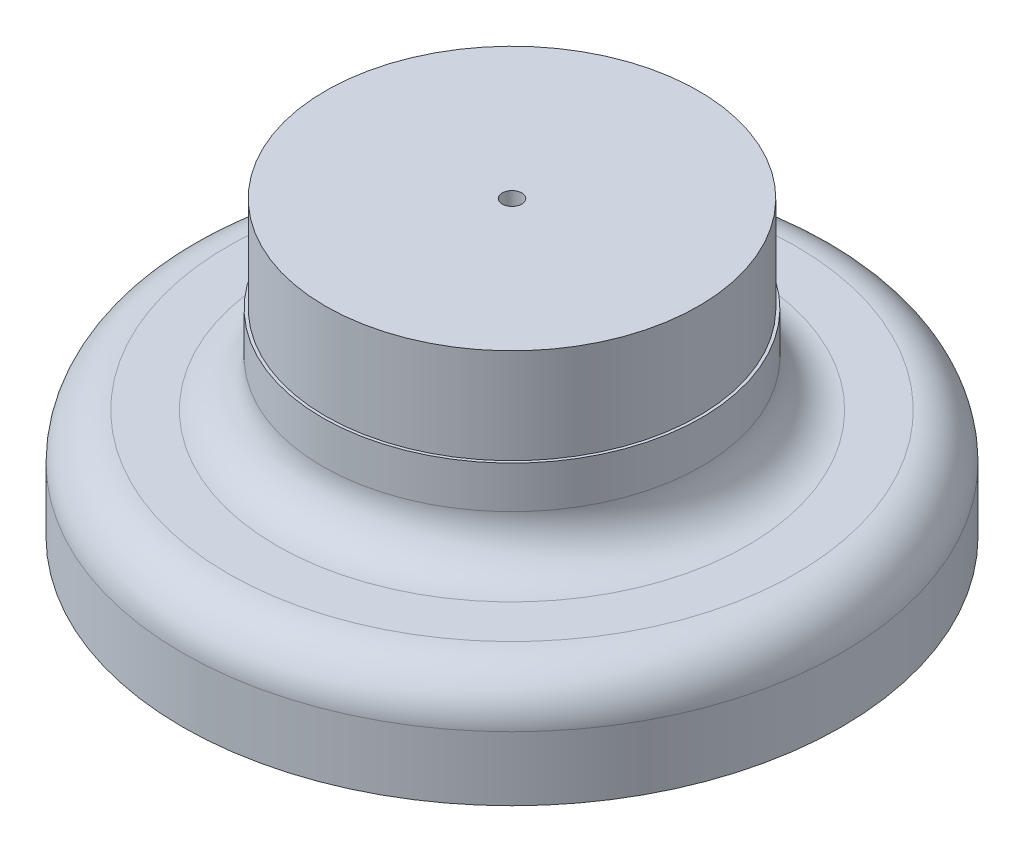
ISO-10303-21;
HEADER;
FILE_DESCRIPTION(('STEP AP214'),'2;1');
FILE_NAME('part.step','',(''),(''),'','','');
FILE_SCHEMA(('AUTOMOTIVE_DESIGN { 1 0 10303 214 1 1 1 1 }'));
ENDSEC;
DATA;
#1=APPLICATION_CONTEXT('core data for automotive mechanical design processes');
#2=APPLICATION_PROTOCOL_DEFINITION('international standard','automotive_design',2000,#1);
#3=PRODUCT_CONTEXT('',#1,'mechanical');
#4=PRODUCT('Part','Part','',(#3));
#5=PRODUCT_RELATED_PRODUCT_CATEGORY('part','',(#4));
#6=PRODUCT_DEFINITION_FORMATION('','',#4);
#7=PRODUCT_DEFINITION_CONTEXT('part definition',#1,'design');
#8=PRODUCT_DEFINITION('design','',#6,#7);
#9=PRODUCT_DEFINITION_SHAPE('','',#8);
#10=(LENGTH_UNIT() NAMED_UNIT(*) SI_UNIT(.MILLI.,.METRE.));
#11=(NAMED_UNIT(*) PLANE_ANGLE_UNIT() SI_UNIT($,.RADIAN.));
#12=(NAMED_UNIT(*) SI_UNIT($,.STERADIAN.) SOLID_ANGLE_UNIT());
#13=UNCERTAINTY_MEASURE_WITH_UNIT(LENGTH_MEASURE(1.E-05),#10,'distance_accuracy_value','');
#14=(GEOMETRIC_REPRESENTATION_CONTEXT(3) GLOBAL_UNCERTAINTY_ASSIGNED_CONTEXT((#13)) GLOBAL_UNIT_ASSIGNED_CONTEXT((#10,
#11,#12)) REPRESENTATION_CONTEXT('',''));
#15=CARTESIAN_POINT('',(0.,0.,0.));
#16=DIRECTION('',(0.,0.,1.));
#17=DIRECTION('',(1.,0.,0.));
#18=AXIS2_PLACEMENT_3D('',#15,#16,#17);
#19=CARTESIAN_POINT('',(0.,38.1,0.));
#20=DIRECTION('',(0.,-1.,0.));
#21=DIRECTION('',(0.,0.,-1.));
#22=AXIS2_PLACEMENT_3D('',#19,#20,#21);
#23=CYLINDRICAL_SURFACE('',#22,114.3);
#24=CARTESIAN_POINT('',(0.,22.225,0.));
#25=DIRECTION('',(0.,1.,0.));
#26=DIRECTION('',(0.,0.,1.));
#27=AXIS2_PLACEMENT_3D('',#24,#25,#26);
#28=CIRCLE('',#27,114.3);
#29=CARTESIAN_POINT('',(0.,22.225,-114.3));
#30=VERTEX_POINT('',#29);
#31=EDGE_CURVE('E10',#30,#30,#28,.F.);
#32=CARTESIAN_POINT('',(0.,0.,0.));
#33=DIRECTION('',(0.,1.,0.));
#34=DIRECTION('',(0.,0.,1.));
#35=AXIS2_PLACEMENT_3D('',#32,#33,#34);
#36=CIRCLE('',#35,114.3);
#37=CARTESIAN_POINT('',(0.,0.,-114.3));
#38=VERTEX_POINT('',#37);
#39=EDGE_CURVE('E57',#38,#38,#36,.T.);
#40=CARTESIAN_POINT('',(0.,22.225,-114.3));
#41=CARTESIAN_POINT('',(0.,21.9934895833333,-114.3));
#42=CARTESIAN_POINT('',(0.,21.7619791666667,-114.3));
#43=CARTESIAN_POINT('',(0.,21.2989583333333,-114.3));
#44=CARTESIAN_POINT('',(0.,21.0674479166667,-114.3));
#45=CARTESIAN_POINT('',(0.,20.6044270833333,-114.3));
#46=CARTESIAN_POINT('',(0.,20.3729166666667,-114.3));
#47=CARTESIAN_POINT('',(0.,19.9098958333333,-114.3));
#48=CARTESIAN_POINT('',(0.,19.6783854166667,-114.3));
#49=CARTESIAN_POINT('',(0.,19.2153645833333,-114.3));
#50=CARTESIAN_POINT('',(0.,18.9838541666667,-114.3));
#51=CARTESIAN_POINT('',(0.,18.5208333333333,-114.3));
#52=CARTESIAN_POINT('',(0.,18.2893229166667,-114.3));
#53=CARTESIAN_POINT('',(0.,17.8263020833333,-114.3));
#54=CARTESIAN_POINT('',(0.,17.5947916666667,-114.3));
#55=CARTESIAN_POINT('',(0.,17.1317708333333,-114.3));
#56=CARTESIAN_POINT('',(0.,16.9002604166667,-114.3));
#57=CARTESIAN_POINT('',(0.,16.4372395833333,-114.3));
#58=CARTESIAN_POINT('',(0.,16.2057291666667,-114.3));
#59=CARTESIAN_POINT('',(0.,15.7427083333333,-114.3));
#60=CARTESIAN_POINT('',(0.,15.5111979166667,-114.3));
#61=CARTESIAN_POINT('',(0.,15.0481770833333,-114.3));
#62=CARTESIAN_POINT('',(0.,14.8166666666667,-114.3));
#63=CARTESIAN_POINT('',(0.,14.3536458333333,-114.3));
#64=CARTESIAN_POINT('',(0.,14.1221354166667,-114.3));
#65=CARTESIAN_POINT('',(0.,13.6591145833333,-114.3));
#66=CARTESIAN_POINT('',(0.,13.4276041666667,-114.3));
#67=CARTESIAN_POINT('',(0.,12.9645833333333,-114.3));
#68=CARTESIAN_POINT('',(0.,12.7330729166667,-114.3));
#69=CARTESIAN_POINT('',(0.,12.2700520833333,-114.3));
#70=CARTESIAN_POINT('',(0.,12.0385416666667,-114.3));
#71=CARTESIAN_POINT('',(0.,11.5755208333333,-114.3));
#72=CARTESIAN_POINT('',(0.,11.3440104166667,-114.3));
#73=CARTESIAN_POINT('',(0.,10.8809895833333,-114.3));
#74=CARTESIAN_POINT('',(0.,10.6494791666667,-114.3));
#75=CARTESIAN_POINT('',(0.,10.1864583333333,-114.3));
#76=CARTESIAN_POINT('',(0.,9.95494791666666,-114.3));
#77=CARTESIAN_POINT('',(0.,9.49192708333333,-114.3));
#78=CARTESIAN_POINT('',(0.,9.26041666666666,-114.3));
#79=CARTESIAN_POINT('',(0.,8.79739583333333,-114.3));
#80=CARTESIAN_POINT('',(0.,8.56588541666667,-114.3));
#81=CARTESIAN_POINT('',(0.,8.10286458333333,-114.3));
#82=CARTESIAN_POINT('',(0.,7.87135416666666,-114.3));
#83=CARTESIAN_POINT('',(0.,7.40833333333333,-114.3));
#84=CARTESIAN_POINT('',(0.,7.17682291666666,-114.3));
#85=CARTESIAN_POINT('',(0.,6.71380208333333,-114.3));
#86=CARTESIAN_POINT('',(0.,6.48229166666667,-114.3));
#87=CARTESIAN_POINT('',(0.,6.01927083333334,-114.3));
#88=CARTESIAN_POINT('',(0.,5.78776041666667,-114.3));
#89=CARTESIAN_POINT('',(0.,5.32473958333333,-114.3));
#90=CARTESIAN_POINT('',(0.,5.09322916666667,-114.3));
#91=CARTESIAN_POINT('',(0.,4.63020833333333,-114.3));
#92=CARTESIAN_POINT('',(0.,4.39869791666667,-114.3));
#93=CARTESIAN_POINT('',(0.,3.93567708333333,-114.3));
#94=CARTESIAN_POINT('',(0.,3.70416666666667,-114.3));
#95=CARTESIAN_POINT('',(0.,3.24114583333333,-114.3));
#96=CARTESIAN_POINT('',(0.,3.00963541666667,-114.3));
#97=CARTESIAN_POINT('',(0.,2.54661458333333,-114.3));
#98=CARTESIAN_POINT('',(0.,2.31510416666667,-114.3));
#99=CARTESIAN_POINT('',(0.,1.85208333333333,-114.3));
#100=CARTESIAN_POINT('',(0.,1.62057291666666,-114.3));
#101=CARTESIAN_POINT('',(0.,1.15755208333333,-114.3));
#102=CARTESIAN_POINT('',(0.,0.926041666666669,-114.3));
#103=CARTESIAN_POINT('',(0.,0.463020833333337,-114.3));
#104=CARTESIAN_POINT('',(0.,0.231510416666668,-114.3));
#105=CARTESIAN_POINT('',(0.,0.,-114.3));
#106=B_SPLINE_CURVE_WITH_KNOTS('',3,(#40,#41,#42,#43,#44,#45,#46,#47,#48,#49,#50,#51,#52,#53,
#54,#55,#56,#57,#58,#59,#60,#61,#62,#63,#64,#65,#66,#67,#68,#69,#70,#71,#72,#73,#74,#75,#76,#77,
#78,#79,#80,#81,#82,#83,#84,#85,#86,#87,#88,#89,#90,#91,#92,#93,#94,#95,#96,#97,#98,#99,#100,
#101,#102,#103,#104,#105),.UNSPECIFIED.,.F.,.F.,(4,2,2,2,2,2,2,2,2,2,2,2,2,2,2,2,2,2,2,2,2,2,2,
2,2,2,2,2,2,2,2,2,4),(0.,0.694531250000002,1.3890625,2.08359375,2.778125,3.47265625,4.1671875,
4.86171875,5.55625,6.25078125,6.9453125,7.63984375,8.334375,9.02890625,9.7234375,10.41796875,
11.1125,11.80703125,12.5015625,13.19609375,13.890625,14.58515625,15.2796875,15.97421875,
16.66875,17.36328125,18.0578125,18.75234375,19.446875,20.14140625,20.8359375,21.53046875,
22.225),.UNSPECIFIED.);
#107=EDGE_CURVE('BSEAM37',#30,#38,#106,.T.);
#108=ORIENTED_EDGE('',*,*,#31,.T.);
#109=ORIENTED_EDGE('',*,*,#39,.T.);
#110=ORIENTED_EDGE('',*,*,#107,.T.);
#111=ORIENTED_EDGE('',*,*,#107,.F.);
#112=EDGE_LOOP('',(#108,#110,#109,#111));
#113=FACE_BOUND('',#112,.T.);
#114=ADVANCED_FACE('F37',(#113),#23,.T.);
#115=CARTESIAN_POINT('',(0.,38.1,0.));
#116=DIRECTION('',(0.,1.,0.));
#117=DIRECTION('',(0.,0.,1.));
#118=AXIS2_PLACEMENT_3D('',#115,#116,#117);
#119=PLANE('',#118);
#120=CARTESIAN_POINT('',(0.,38.1,0.));
#121=DIRECTION('',(0.,1.,0.));
#122=DIRECTION('',(0.,0.,1.));
#123=AXIS2_PLACEMENT_3D('',#120,#121,#122);
#124=CIRCLE('',#123,98.425);
#125=CARTESIAN_POINT('',(0.,38.1,98.425));
#126=VERTEX_POINT('',#125);
#127=EDGE_CURVE('E44',#126,#126,#124,.T.);
#128=ORIENTED_EDGE('',*,*,#127,.T.);
#129=EDGE_LOOP('',(#128));
#130=FACE_BOUND('',#129,.T.);
#131=CARTESIAN_POINT('',(0.,38.1,0.));
#132=DIRECTION('',(0.,1.,0.));
#133=DIRECTION('',(0.,0.,1.));
#134=AXIS2_PLACEMENT_3D('',#131,#132,#133);
#135=CIRCLE('',#134,81.5975);
#136=CARTESIAN_POINT('',(0.,38.1,81.5975));
#137=VERTEX_POINT('',#136);
#138=EDGE_CURVE('E48',#137,#137,#135,.F.);
#139=ORIENTED_EDGE('',*,*,#138,.T.);
#140=EDGE_LOOP('',(#139));
#141=FACE_BOUND('',#140,.T.);
#142=ADVANCED_FACE('F85',(#130,#141),#119,.T.);
#143=CARTESIAN_POINT('',(0.,0.,0.));
#144=DIRECTION('',(0.,1.,0.));
#145=DIRECTION('',(0.,0.,1.));
#146=AXIS2_PLACEMENT_3D('',#143,#144,#145);
#147=PLANE('',#146);
#148=CARTESIAN_POINT('',(0.,0.,0.));
#149=DIRECTION('',(0.,-1.,0.));
#150=DIRECTION('',(0.,0.,-1.));
#151=AXIS2_PLACEMENT_3D('',#148,#149,#150);
#152=CIRCLE('',#151,6.4389);
#153=CARTESIAN_POINT('',(0.,0.,-6.4389));
#154=VERTEX_POINT('',#153);
#155=EDGE_CURVE('E75',#154,#154,#152,.T.);
#156=ORIENTED_EDGE('',*,*,#155,.F.);
#157=EDGE_LOOP('',(#156));
#158=FACE_BOUND('',#157,.T.);
#159=ORIENTED_EDGE('',*,*,#39,.F.);
#160=EDGE_LOOP('',(#159));
#161=FACE_BOUND('',#160,.T.);
#162=ADVANCED_FACE('F81',(#158,#161),#147,.F.);
#163=CARTESIAN_POINT('',(0.,68.58,0.));
#164=DIRECTION('',(0.,-1.,0.));
#165=DIRECTION('',(0.,0.,-1.));
#166=AXIS2_PLACEMENT_3D('',#163,#164,#165);
#167=CYLINDRICAL_SURFACE('',#166,65.7225);
#168=CARTESIAN_POINT('',(0.,53.975,0.));
#169=DIRECTION('',(0.,1.,0.));
#170=DIRECTION('',(0.,0.,1.));
#171=AXIS2_PLACEMENT_3D('',#168,#169,#170);
#172=CIRCLE('',#171,65.7225);
#173=CARTESIAN_POINT('',(0.,53.975,65.7225));
#174=VERTEX_POINT('',#173);
#175=EDGE_CURVE('E52',#174,#174,#172,.T.);
#176=ORIENTED_EDGE('',*,*,#175,.T.);
#177=EDGE_LOOP('',(#176));
#178=FACE_BOUND('',#177,.T.);
#179=CARTESIAN_POINT('',(0.,68.58,0.));
#180=DIRECTION('',(0.,1.,0.));
#181=DIRECTION('',(0.,0.,1.));
#182=AXIS2_PLACEMENT_3D('',#179,#180,#181);
#183=CIRCLE('',#182,65.7225);
#184=CARTESIAN_POINT('',(0.,68.58,65.7225));
#185=VERTEX_POINT('',#184);
#186=EDGE_CURVE('E60',#185,#185,#183,.T.);
#187=ORIENTED_EDGE('',*,*,#186,.F.);
#188=EDGE_LOOP('',(#187));
#189=FACE_BOUND('',#188,.T.);
#190=ADVANCED_FACE('F84',(#178,#189),#167,.T.);
#191=CARTESIAN_POINT('',(0.,68.58,0.));
#192=DIRECTION('',(0.,1.,0.));
#193=DIRECTION('',(0.,0.,1.));
#194=AXIS2_PLACEMENT_3D('',#191,#192,#193);
#195=PLANE('',#194);
#196=CARTESIAN_POINT('',(0.,68.58,0.));
#197=DIRECTION('',(0.,1.,0.));
#198=DIRECTION('',(0.,0.,1.));
#199=AXIS2_PLACEMENT_3D('',#196,#197,#198);
#200=CIRCLE('',#199,64.7065);
#201=CARTESIAN_POINT('',(0.,68.58,64.7065));
#202=VERTEX_POINT('',#201);
#203=EDGE_CURVE('E63',#202,#202,#200,.T.);
#204=ORIENTED_EDGE('',*,*,#203,.F.);
#205=EDGE_LOOP('',(#204));
#206=FACE_BOUND('',#205,.T.);
#207=ORIENTED_EDGE('',*,*,#186,.T.);
#208=EDGE_LOOP('',(#207));
#209=FACE_BOUND('',#208,.T.);
#210=ADVANCED_FACE('F112',(#206,#209),#195,.T.);
#211=CARTESIAN_POINT('',(0.,101.6,0.));
#212=DIRECTION('',(0.,1.,0.));
#213=DIRECTION('',(0.,0.,1.));
#214=AXIS2_PLACEMENT_3D('',#211,#212,#213);
#215=PLANE('',#214);
#216=CARTESIAN_POINT('',(0.,101.6,0.));
#217=DIRECTION('',(0.,-1.,0.));
#218=DIRECTION('',(0.,0.,-1.));
#219=AXIS2_PLACEMENT_3D('',#216,#217,#218);
#220=CIRCLE('',#219,3.37819999999998);
#221=CARTESIAN_POINT('',(0.,101.6,-3.37819999999998));
#222=VERTEX_POINT('',#221);
#223=EDGE_CURVE('E69',#222,#222,#220,.T.);
#224=ORIENTED_EDGE('',*,*,#223,.T.);
#225=EDGE_LOOP('',(#224));
#226=FACE_BOUND('',#225,.T.);
#227=CARTESIAN_POINT('',(0.,101.6,0.));
#228=DIRECTION('',(0.,1.,0.));
#229=DIRECTION('',(0.,0.,1.));
#230=AXIS2_PLACEMENT_3D('',#227,#228,#229);
#231=CIRCLE('',#230,64.7065);
#232=CARTESIAN_POINT('',(0.,101.6,64.7065));
#233=VERTEX_POINT('',#232);
#234=EDGE_CURVE('E66',#233,#233,#231,.T.);
#235=ORIENTED_EDGE('',*,*,#234,.T.);
#236=EDGE_LOOP('',(#235));
#237=FACE_BOUND('',#236,.T.);
#238=ADVANCED_FACE('F117',(#226,#237),#215,.T.);
#239=CARTESIAN_POINT('',(0.,101.6,0.));
#240=DIRECTION('',(0.,-1.,0.));
#241=DIRECTION('',(0.,0.,-1.));
#242=AXIS2_PLACEMENT_3D('',#239,#240,#241);
#243=CYLINDRICAL_SURFACE('',#242,64.7065);
#244=ORIENTED_EDGE('',*,*,#203,.T.);
#245=EDGE_LOOP('',(#244));
#246=FACE_BOUND('',#245,.T.);
#247=ORIENTED_EDGE('',*,*,#234,.F.);
#248=EDGE_LOOP('',(#247));
#249=FACE_BOUND('',#248,.T.);
#250=ADVANCED_FACE('F123',(#246,#249),#243,.T.);
#251=CARTESIAN_POINT('',(0.,0.,0.));
#252=DIRECTION('',(0.,-1.,0.));
#253=DIRECTION('',(0.,0.,-1.));
#254=AXIS2_PLACEMENT_3D('',#251,#252,#253);
#255=CYLINDRICAL_SURFACE('',#254,3.37819999999999);
#256=ORIENTED_EDGE('',*,*,#223,.F.);
#257=EDGE_LOOP('',(#256));
#258=FACE_BOUND('',#257,.T.);
#259=CARTESIAN_POINT('',(0.,2.5682322411443,0.));
#260=DIRECTION('',(0.,-1.,0.));
#261=DIRECTION('',(0.,0.,-1.));
#262=AXIS2_PLACEMENT_3D('',#259,#260,#261);
#263=CIRCLE('',#262,3.37819999999999);
#264=CARTESIAN_POINT('',(0.,2.5682322411443,-3.37819999999999));
#265=VERTEX_POINT('',#264);
#266=EDGE_CURVE('E72',#265,#265,#263,.T.);
#267=ORIENTED_EDGE('',*,*,#266,.T.);
#268=EDGE_LOOP('',(#267));
#269=FACE_BOUND('',#268,.T.);
#270=ADVANCED_FACE('F103',(#258,#269),#255,.F.);
#271=CARTESIAN_POINT('',(0.,0.,0.));
#272=DIRECTION('',(0.,-1.,0.));
#273=DIRECTION('',(0.,0.,-1.));
#274=AXIS2_PLACEMENT_3D('',#271,#272,#273);
#275=CONICAL_SURFACE('',#274,6.4389,0.872664625997167);
#276=ORIENTED_EDGE('',*,*,#266,.F.);
#277=EDGE_LOOP('',(#276));
#278=FACE_BOUND('',#277,.T.);
#279=ORIENTED_EDGE('',*,*,#155,.T.);
#280=EDGE_LOOP('',(#279));
#281=FACE_BOUND('',#280,.T.);
#282=ADVANCED_FACE('F79',(#278,#281),#275,.F.);
#283=CARTESIAN_POINT('',(0.,53.975,0.));
#284=DIRECTION('',(0.,1.,0.));
#285=DIRECTION('',(0.,0.,1.));
#286=AXIS2_PLACEMENT_3D('',#283,#284,#285);
#287=TOROIDAL_SURFACE('',#286,81.5975,15.875);
#288=ORIENTED_EDGE('',*,*,#138,.F.);
#289=EDGE_LOOP('',(#288));
#290=FACE_BOUND('',#289,.T.);
#291=ORIENTED_EDGE('',*,*,#175,.F.);
#292=EDGE_LOOP('',(#291));
#293=FACE_BOUND('',#292,.T.);
#294=ADVANCED_FACE('F95',(#290,#293),#287,.F.);
#295=CARTESIAN_POINT('',(0.,22.225,0.));
#296=DIRECTION('',(0.,1.,0.));
#297=DIRECTION('',(0.,0.,1.));
#298=AXIS2_PLACEMENT_3D('',#295,#296,#297);
#299=TOROIDAL_SURFACE('',#298,98.425,15.875);
#300=ORIENTED_EDGE('',*,*,#31,.F.);
#301=EDGE_LOOP('',(#300));
#302=FACE_BOUND('',#301,.T.);
#303=ORIENTED_EDGE('',*,*,#127,.F.);
#304=EDGE_LOOP('',(#303));
#305=FACE_BOUND('',#304,.T.);
#306=ADVANCED_FACE('F39',(#302,#305),#299,.T.);
#307=CLOSED_SHELL('',(#114,#142,#162,#190,#210,#238,#250,#270,#282,#294,#306));
#308=MANIFOLD_SOLID_BREP('B2',#307);
#309=ADVANCED_BREP_SHAPE_REPRESENTATION('',(#18,#308),#14);
#310=SHAPE_DEFINITION_REPRESENTATION(#9,#309);
ENDSEC;
END-ISO-10303-21;
